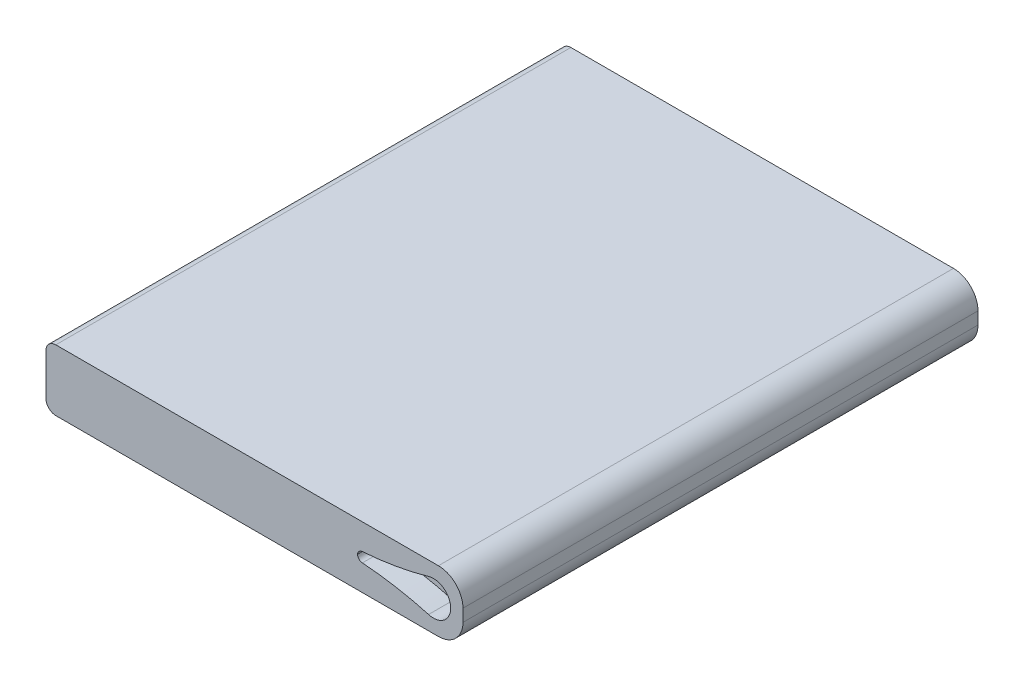
ISO-10303-21;
HEADER;
FILE_DESCRIPTION(('STEP AP214'),'2;1');
FILE_NAME('part.step','',(''),(''),'','','');
FILE_SCHEMA(('AUTOMOTIVE_DESIGN { 1 0 10303 214 1 1 1 1 }'));
ENDSEC;
DATA;
#1=APPLICATION_CONTEXT('core data for automotive mechanical design processes');
#2=APPLICATION_PROTOCOL_DEFINITION('international standard','automotive_design',2000,#1);
#3=PRODUCT_CONTEXT('',#1,'mechanical');
#4=PRODUCT('Part','Part','',(#3));
#5=PRODUCT_RELATED_PRODUCT_CATEGORY('part','',(#4));
#6=PRODUCT_DEFINITION_FORMATION('','',#4);
#7=PRODUCT_DEFINITION_CONTEXT('part definition',#1,'design');
#8=PRODUCT_DEFINITION('design','',#6,#7);
#9=PRODUCT_DEFINITION_SHAPE('','',#8);
#10=(LENGTH_UNIT() NAMED_UNIT(*) SI_UNIT(.MILLI.,.METRE.));
#11=(NAMED_UNIT(*) PLANE_ANGLE_UNIT() SI_UNIT($,.RADIAN.));
#12=(NAMED_UNIT(*) SI_UNIT($,.STERADIAN.) SOLID_ANGLE_UNIT());
#13=UNCERTAINTY_MEASURE_WITH_UNIT(LENGTH_MEASURE(1.E-05),#10,'distance_accuracy_value','');
#14=(GEOMETRIC_REPRESENTATION_CONTEXT(3) GLOBAL_UNCERTAINTY_ASSIGNED_CONTEXT((#13)) GLOBAL_UNIT_ASSIGNED_CONTEXT((#10,
#11,#12)) REPRESENTATION_CONTEXT('',''));
#15=CARTESIAN_POINT('',(0.,0.,0.));
#16=DIRECTION('',(0.,0.,1.));
#17=DIRECTION('',(1.,0.,0.));
#18=AXIS2_PLACEMENT_3D('',#15,#16,#17);
#19=CARTESIAN_POINT('',(0.,12.5,0.));
#20=DIRECTION('',(0.,0.,-1.));
#21=DIRECTION('',(-1.,0.,0.));
#22=AXIS2_PLACEMENT_3D('',#19,#20,#21);
#23=PLANE('',#22);
#24=DIRECTION('',(0.,-1.,0.));
#25=VECTOR('',#24,1.);
#26=CARTESIAN_POINT('',(-4.99999999999999,12.5,0.));
#27=LINE('',#26,#25);
#28=CARTESIAN_POINT('',(-4.99999999999999,10.5,0.));
#29=VERTEX_POINT('',#28);
#30=CARTESIAN_POINT('',(-4.99999999999999,2.,0.));
#31=VERTEX_POINT('',#30);
#32=EDGE_CURVE('E224',#29,#31,#27,.T.);
#33=ORIENTED_EDGE('',*,*,#32,.T.);
#34=CARTESIAN_POINT('',(-2.99999999999999,2.,0.));
#35=DIRECTION('',(0.,0.,-1.));
#36=DIRECTION('',(-1.,0.,0.));
#37=AXIS2_PLACEMENT_3D('',#34,#35,#36);
#38=CIRCLE('',#37,2.);
#39=CARTESIAN_POINT('',(-2.99999999999999,0.,0.));
#40=VERTEX_POINT('',#39);
#41=EDGE_CURVE('E298',#31,#40,#38,.F.);
#42=ORIENTED_EDGE('',*,*,#41,.T.);
#43=DIRECTION('',(1.,0.,0.));
#44=VECTOR('',#43,1.);
#45=CARTESIAN_POINT('',(0.,0.,0.));
#46=LINE('',#45,#44);
#47=CARTESIAN_POINT('',(75.,0.,0.));
#48=VERTEX_POINT('',#47);
#49=EDGE_CURVE('E237',#40,#48,#46,.T.);
#50=ORIENTED_EDGE('',*,*,#49,.T.);
#51=CARTESIAN_POINT('',(75.,5.,0.));
#52=DIRECTION('',(0.,0.,-1.));
#53=DIRECTION('',(-1.,0.,0.));
#54=AXIS2_PLACEMENT_3D('',#51,#52,#53);
#55=CIRCLE('',#54,5.);
#56=CARTESIAN_POINT('',(80.,5.,0.));
#57=VERTEX_POINT('',#56);
#58=EDGE_CURVE('E270',#48,#57,#55,.F.);
#59=ORIENTED_EDGE('',*,*,#58,.T.);
#60=DIRECTION('',(0.,-1.,0.));
#61=VECTOR('',#60,1.);
#62=CARTESIAN_POINT('',(80.,12.5,0.));
#63=LINE('',#62,#61);
#64=CARTESIAN_POINT('',(80.,7.5,0.));
#65=VERTEX_POINT('',#64);
#66=EDGE_CURVE('E247',#65,#57,#63,.T.);
#67=ORIENTED_EDGE('',*,*,#66,.F.);
#68=CARTESIAN_POINT('',(75.,7.5,0.));
#69=DIRECTION('',(0.,0.,-1.));
#70=DIRECTION('',(-1.,0.,0.));
#71=AXIS2_PLACEMENT_3D('',#68,#69,#70);
#72=CIRCLE('',#71,5.);
#73=CARTESIAN_POINT('',(75.,12.5,0.));
#74=VERTEX_POINT('',#73);
#75=EDGE_CURVE('E284',#65,#74,#72,.F.);
#76=ORIENTED_EDGE('',*,*,#75,.T.);
#77=DIRECTION('',(1.,0.,0.));
#78=VECTOR('',#77,1.);
#79=CARTESIAN_POINT('',(0.,12.5,0.));
#80=LINE('',#79,#78);
#81=CARTESIAN_POINT('',(-2.99999999999999,12.5,0.));
#82=VERTEX_POINT('',#81);
#83=EDGE_CURVE('E236',#82,#74,#80,.T.);
#84=ORIENTED_EDGE('',*,*,#83,.F.);
#85=CARTESIAN_POINT('',(-2.99999999999999,10.5,0.));
#86=DIRECTION('',(0.,0.,-1.));
#87=DIRECTION('',(-1.,0.,0.));
#88=AXIS2_PLACEMENT_3D('',#85,#86,#87);
#89=CIRCLE('',#88,2.);
#90=EDGE_CURVE('E295',#82,#29,#89,.F.);
#91=ORIENTED_EDGE('',*,*,#90,.T.);
#92=EDGE_LOOP('',(#33,#42,#50,#59,#67,#76,#84,#91));
#93=FACE_BOUND('',#92,.T.);
#94=CARTESIAN_POINT('',(59.5740057832264,6.17599421677323,0.));
#95=DIRECTION('',(0.,0.,1.));
#96=DIRECTION('',(1.,0.,0.));
#97=AXIS2_PLACEMENT_3D('',#94,#95,#96);
#98=CIRCLE('',#97,1.0765524967946);
#99=CARTESIAN_POINT('',(58.5,6.25,0.));
#100=VERTEX_POINT('',#99);
#101=CARTESIAN_POINT('',(59.5000000000056,7.25,0.));
#102=VERTEX_POINT('',#101);
#103=EDGE_CURVE('E174',#100,#102,#98,.F.);
#104=ORIENTED_EDGE('',*,*,#103,.T.);
#105=CARTESIAN_POINT('',(54.9560208388996,73.1943044244566,0.));
#106=DIRECTION('',(0.,0.,1.));
#107=DIRECTION('',(1.,0.,0.));
#108=AXIS2_PLACEMENT_3D('',#105,#106,#107);
#109=CIRCLE('',#108,66.1006734658731);
#110=CARTESIAN_POINT('',(73.,9.60410196624968,0.));
#111=VERTEX_POINT('',#110);
#112=EDGE_CURVE('E190',#102,#111,#109,.T.);
#113=ORIENTED_EDGE('',*,*,#112,.T.);
#114=CARTESIAN_POINT('',(74.,6.25,0.));
#115=DIRECTION('',(0.,0.,1.));
#116=DIRECTION('',(1.,0.,0.));
#117=AXIS2_PLACEMENT_3D('',#114,#115,#116);
#118=CIRCLE('',#117,3.50000000000001);
#119=CARTESIAN_POINT('',(73.,2.89589803375032,0.));
#120=VERTEX_POINT('',#119);
#121=EDGE_CURVE('E214',#120,#111,#118,.T.);
#122=ORIENTED_EDGE('',*,*,#121,.F.);
#123=CARTESIAN_POINT('',(54.231345292948,-64.8500801770038,0.));
#124=DIRECTION('',(0.,0.,1.));
#125=DIRECTION('',(1.,0.,0.));
#126=AXIS2_PLACEMENT_3D('',#123,#124,#125);
#127=CIRCLE('',#126,70.2977948675812);
#128=CARTESIAN_POINT('',(59.5000000000014,5.25,0.));
#129=VERTEX_POINT('',#128);
#130=EDGE_CURVE('E210',#129,#120,#127,.F.);
#131=ORIENTED_EDGE('',*,*,#130,.F.);
#132=CARTESIAN_POINT('',(59.5812669884853,6.33126698848544,0.));
#133=DIRECTION('',(0.,0.,1.));
#134=DIRECTION('',(1.,0.,0.));
#135=AXIS2_PLACEMENT_3D('',#132,#133,#134);
#136=CIRCLE('',#135,1.08431666214516);
#137=EDGE_CURVE('E207',#100,#129,#136,.T.);
#138=ORIENTED_EDGE('',*,*,#137,.F.);
#139=EDGE_LOOP('',(#104,#113,#122,#131,#138));
#140=FACE_BOUND('',#139,.T.);
#141=ADVANCED_FACE('F69',(#93,#140),#23,.F.);
#142=CARTESIAN_POINT('',(0.,12.5,-105.));
#143=DIRECTION('',(0.,0.,-1.));
#144=DIRECTION('',(-1.,0.,0.));
#145=AXIS2_PLACEMENT_3D('',#142,#143,#144);
#146=PLANE('',#145);
#147=DIRECTION('',(1.,0.,0.));
#148=VECTOR('',#147,1.);
#149=CARTESIAN_POINT('',(0.,0.,-105.));
#150=LINE('',#149,#148);
#151=CARTESIAN_POINT('',(-3.,0.,-105.));
#152=VERTEX_POINT('',#151);
#153=CARTESIAN_POINT('',(75.,0.,-105.));
#154=VERTEX_POINT('',#153);
#155=EDGE_CURVE('E241',#152,#154,#150,.T.);
#156=ORIENTED_EDGE('',*,*,#155,.F.);
#157=CARTESIAN_POINT('',(-3.,2.,-105.));
#158=DIRECTION('',(0.,0.,-1.));
#159=DIRECTION('',(-1.,0.,0.));
#160=AXIS2_PLACEMENT_3D('',#157,#158,#159);
#161=CIRCLE('',#160,2.);
#162=CARTESIAN_POINT('',(-5.,2.,-105.));
#163=VERTEX_POINT('',#162);
#164=EDGE_CURVE('E78',#152,#163,#161,.T.);
#165=ORIENTED_EDGE('',*,*,#164,.T.);
#166=DIRECTION('',(0.,-1.,0.));
#167=VECTOR('',#166,1.);
#168=CARTESIAN_POINT('',(-5.,12.5,-105.));
#169=LINE('',#168,#167);
#170=CARTESIAN_POINT('',(-5.,10.5,-105.));
#171=VERTEX_POINT('',#170);
#172=EDGE_CURVE('E244',#171,#163,#169,.T.);
#173=ORIENTED_EDGE('',*,*,#172,.F.);
#174=CARTESIAN_POINT('',(-3.,10.5,-105.));
#175=DIRECTION('',(0.,0.,-1.));
#176=DIRECTION('',(-1.,0.,0.));
#177=AXIS2_PLACEMENT_3D('',#174,#175,#176);
#178=CIRCLE('',#177,2.);
#179=CARTESIAN_POINT('',(-3.,12.5,-105.));
#180=VERTEX_POINT('',#179);
#181=EDGE_CURVE('E85',#171,#180,#178,.T.);
#182=ORIENTED_EDGE('',*,*,#181,.T.);
#183=DIRECTION('',(1.,0.,0.));
#184=VECTOR('',#183,1.);
#185=CARTESIAN_POINT('',(0.,12.5,-105.));
#186=LINE('',#185,#184);
#187=CARTESIAN_POINT('',(75.,12.5,-105.));
#188=VERTEX_POINT('',#187);
#189=EDGE_CURVE('E233',#180,#188,#186,.T.);
#190=ORIENTED_EDGE('',*,*,#189,.T.);
#191=CARTESIAN_POINT('',(75.,7.5,-105.));
#192=DIRECTION('',(0.,0.,-1.));
#193=DIRECTION('',(-1.,0.,0.));
#194=AXIS2_PLACEMENT_3D('',#191,#192,#193);
#195=CIRCLE('',#194,5.);
#196=CARTESIAN_POINT('',(80.,7.5,-105.));
#197=VERTEX_POINT('',#196);
#198=EDGE_CURVE('E278',#188,#197,#195,.T.);
#199=ORIENTED_EDGE('',*,*,#198,.T.);
#200=DIRECTION('',(0.,-1.,0.));
#201=VECTOR('',#200,1.);
#202=CARTESIAN_POINT('',(80.,12.5,-105.));
#203=LINE('',#202,#201);
#204=CARTESIAN_POINT('',(80.,5.,-105.));
#205=VERTEX_POINT('',#204);
#206=EDGE_CURVE('E240',#197,#205,#203,.T.);
#207=ORIENTED_EDGE('',*,*,#206,.T.);
#208=CARTESIAN_POINT('',(75.,5.,-105.));
#209=DIRECTION('',(0.,0.,-1.));
#210=DIRECTION('',(-1.,0.,0.));
#211=AXIS2_PLACEMENT_3D('',#208,#209,#210);
#212=CIRCLE('',#211,5.);
#213=EDGE_CURVE('E262',#205,#154,#212,.T.);
#214=ORIENTED_EDGE('',*,*,#213,.T.);
#215=EDGE_LOOP('',(#156,#165,#173,#182,#190,#199,#207,#214));
#216=FACE_BOUND('',#215,.T.);
#217=ADVANCED_FACE('F306',(#216),#146,.T.);
#218=CARTESIAN_POINT('',(0.,0.,0.));
#219=DIRECTION('',(0.,1.,0.));
#220=DIRECTION('',(0.,0.,1.));
#221=AXIS2_PLACEMENT_3D('',#218,#219,#220);
#222=PLANE('',#221);
#223=ORIENTED_EDGE('',*,*,#49,.F.);
#224=DIRECTION('',(0.,0.,1.));
#225=VECTOR('',#224,1.);
#226=CARTESIAN_POINT('',(-2.99999999999999,0.,0.));
#227=LINE('',#226,#225);
#228=EDGE_CURVE('E93',#40,#152,#227,.F.);
#229=ORIENTED_EDGE('',*,*,#228,.T.);
#230=ORIENTED_EDGE('',*,*,#155,.T.);
#231=DIRECTION('',(0.,0.,-1.));
#232=VECTOR('',#231,1.);
#233=CARTESIAN_POINT('',(75.,0.,0.));
#234=LINE('',#233,#232);
#235=EDGE_CURVE('E266',#154,#48,#234,.F.);
#236=ORIENTED_EDGE('',*,*,#235,.T.);
#237=EDGE_LOOP('',(#223,#229,#230,#236));
#238=FACE_BOUND('',#237,.T.);
#239=ADVANCED_FACE('F316',(#238),#222,.F.);
#240=CARTESIAN_POINT('',(80.,12.5,0.));
#241=DIRECTION('',(-1.,0.,0.));
#242=DIRECTION('',(0.,0.,1.));
#243=AXIS2_PLACEMENT_3D('',#240,#241,#242);
#244=PLANE('',#243);
#245=ORIENTED_EDGE('',*,*,#206,.F.);
#246=DIRECTION('',(0.,0.,-1.));
#247=VECTOR('',#246,1.);
#248=CARTESIAN_POINT('',(80.,7.5,0.));
#249=LINE('',#248,#247);
#250=EDGE_CURVE('E281',#197,#65,#249,.F.);
#251=ORIENTED_EDGE('',*,*,#250,.T.);
#252=ORIENTED_EDGE('',*,*,#66,.T.);
#253=DIRECTION('',(0.,0.,-1.));
#254=VECTOR('',#253,1.);
#255=CARTESIAN_POINT('',(80.,5.,0.));
#256=LINE('',#255,#254);
#257=EDGE_CURVE('E250',#57,#205,#256,.T.);
#258=ORIENTED_EDGE('',*,*,#257,.T.);
#259=EDGE_LOOP('',(#245,#251,#252,#258));
#260=FACE_BOUND('',#259,.T.);
#261=ADVANCED_FACE('F347',(#260),#244,.F.);
#262=CARTESIAN_POINT('',(0.,12.5,0.));
#263=DIRECTION('',(0.,1.,0.));
#264=DIRECTION('',(0.,0.,1.));
#265=AXIS2_PLACEMENT_3D('',#262,#263,#264);
#266=PLANE('',#265);
#267=ORIENTED_EDGE('',*,*,#189,.F.);
#268=DIRECTION('',(0.,0.,1.));
#269=VECTOR('',#268,1.);
#270=CARTESIAN_POINT('',(-2.99999999999999,12.5,0.));
#271=LINE('',#270,#269);
#272=EDGE_CURVE('E12',#180,#82,#271,.T.);
#273=ORIENTED_EDGE('',*,*,#272,.T.);
#274=ORIENTED_EDGE('',*,*,#83,.T.);
#275=DIRECTION('',(0.,0.,-1.));
#276=VECTOR('',#275,1.);
#277=CARTESIAN_POINT('',(75.,12.5,-105.));
#278=LINE('',#277,#276);
#279=EDGE_CURVE('E274',#74,#188,#278,.T.);
#280=ORIENTED_EDGE('',*,*,#279,.T.);
#281=EDGE_LOOP('',(#267,#273,#274,#280));
#282=FACE_BOUND('',#281,.T.);
#283=ADVANCED_FACE('F333',(#282),#266,.T.);
#284=CARTESIAN_POINT('',(-5.,12.5,-105.));
#285=DIRECTION('',(1.,0.,0.));
#286=DIRECTION('',(0.,0.,-1.));
#287=AXIS2_PLACEMENT_3D('',#284,#285,#286);
#288=PLANE('',#287);
#289=ORIENTED_EDGE('',*,*,#172,.T.);
#290=DIRECTION('',(0.,0.,1.));
#291=VECTOR('',#290,1.);
#292=CARTESIAN_POINT('',(-5.,2.,-105.));
#293=LINE('',#292,#291);
#294=EDGE_CURVE('E291',#163,#31,#293,.T.);
#295=ORIENTED_EDGE('',*,*,#294,.T.);
#296=ORIENTED_EDGE('',*,*,#32,.F.);
#297=DIRECTION('',(0.,0.,1.));
#298=VECTOR('',#297,1.);
#299=CARTESIAN_POINT('',(-5.,10.5,-105.));
#300=LINE('',#299,#298);
#301=EDGE_CURVE('E288',#29,#171,#300,.F.);
#302=ORIENTED_EDGE('',*,*,#301,.T.);
#303=EDGE_LOOP('',(#289,#295,#296,#302));
#304=FACE_BOUND('',#303,.T.);
#305=ADVANCED_FACE('F310',(#304),#288,.F.);
#306=CARTESIAN_POINT('',(59.5740057832264,6.17599421677323,-5.));
#307=DIRECTION('',(0.,0.,1.));
#308=DIRECTION('',(1.,0.,0.));
#309=AXIS2_PLACEMENT_3D('',#306,#307,#308);
#310=CYLINDRICAL_SURFACE('',#309,1.0765524967946);
#311=ORIENTED_EDGE('',*,*,#103,.F.);
#312=DIRECTION('',(0.,0.,1.));
#313=VECTOR('',#312,1.);
#314=CARTESIAN_POINT('',(58.5,6.25,-5.));
#315=LINE('',#314,#313);
#316=CARTESIAN_POINT('',(58.5,6.25,-5.));
#317=VERTEX_POINT('',#316);
#318=EDGE_CURVE('E167',#317,#100,#315,.T.);
#319=ORIENTED_EDGE('',*,*,#318,.F.);
#320=CARTESIAN_POINT('',(59.5740057832264,6.17599421677323,-5.));
#321=DIRECTION('',(0.,0.,1.));
#322=DIRECTION('',(1.,0.,0.));
#323=AXIS2_PLACEMENT_3D('',#320,#321,#322);
#324=CIRCLE('',#323,1.0765524967946);
#325=CARTESIAN_POINT('',(59.5000000000056,7.25,-5.));
#326=VERTEX_POINT('',#325);
#327=EDGE_CURVE('E171',#317,#326,#324,.F.);
#328=ORIENTED_EDGE('',*,*,#327,.T.);
#329=DIRECTION('',(0.,0.,1.));
#330=VECTOR('',#329,1.);
#331=CARTESIAN_POINT('',(59.5000000000056,7.25,-5.));
#332=LINE('',#331,#330);
#333=EDGE_CURVE('E221',#326,#102,#332,.T.);
#334=ORIENTED_EDGE('',*,*,#333,.T.);
#335=EDGE_LOOP('',(#311,#319,#328,#334));
#336=FACE_BOUND('',#335,.T.);
#337=ADVANCED_FACE('F169',(#336),#310,.F.);
#338=CARTESIAN_POINT('',(54.9560208388996,73.1943044244566,-5.));
#339=DIRECTION('',(0.,0.,1.));
#340=DIRECTION('',(1.,0.,0.));
#341=AXIS2_PLACEMENT_3D('',#338,#339,#340);
#342=CYLINDRICAL_SURFACE('',#341,66.1006734658731);
#343=ORIENTED_EDGE('',*,*,#112,.F.);
#344=ORIENTED_EDGE('',*,*,#333,.F.);
#345=CARTESIAN_POINT('',(54.9560208388996,73.1943044244566,-5.));
#346=DIRECTION('',(0.,0.,1.));
#347=DIRECTION('',(1.,0.,0.));
#348=AXIS2_PLACEMENT_3D('',#345,#346,#347);
#349=CIRCLE('',#348,66.1006734658731);
#350=CARTESIAN_POINT('',(73.,9.60410196624968,-5.));
#351=VERTEX_POINT('',#350);
#352=EDGE_CURVE('E181',#326,#351,#349,.T.);
#353=ORIENTED_EDGE('',*,*,#352,.T.);
#354=DIRECTION('',(0.,0.,1.));
#355=VECTOR('',#354,1.);
#356=CARTESIAN_POINT('',(73.,9.60410196624968,-5.));
#357=LINE('',#356,#355);
#358=EDGE_CURVE('E225',#351,#111,#357,.T.);
#359=ORIENTED_EDGE('',*,*,#358,.T.);
#360=EDGE_LOOP('',(#343,#344,#353,#359));
#361=FACE_BOUND('',#360,.T.);
#362=ADVANCED_FACE('F359',(#361),#342,.T.);
#363=CARTESIAN_POINT('',(74.,6.25,-5.));
#364=DIRECTION('',(0.,0.,1.));
#365=DIRECTION('',(1.,0.,0.));
#366=AXIS2_PLACEMENT_3D('',#363,#364,#365);
#367=CYLINDRICAL_SURFACE('',#366,3.50000000000001);
#368=ORIENTED_EDGE('',*,*,#121,.T.);
#369=ORIENTED_EDGE('',*,*,#358,.F.);
#370=CARTESIAN_POINT('',(74.,6.25,-5.));
#371=DIRECTION('',(0.,0.,1.));
#372=DIRECTION('',(1.,0.,0.));
#373=AXIS2_PLACEMENT_3D('',#370,#371,#372);
#374=CIRCLE('',#373,3.50000000000001);
#375=CARTESIAN_POINT('',(73.,2.89589803375032,-5.));
#376=VERTEX_POINT('',#375);
#377=EDGE_CURVE('E198',#376,#351,#374,.T.);
#378=ORIENTED_EDGE('',*,*,#377,.F.);
#379=DIRECTION('',(0.,0.,1.));
#380=VECTOR('',#379,1.);
#381=CARTESIAN_POINT('',(73.,2.89589803375032,-5.));
#382=LINE('',#381,#380);
#383=EDGE_CURVE('E228',#376,#120,#382,.T.);
#384=ORIENTED_EDGE('',*,*,#383,.T.);
#385=EDGE_LOOP('',(#368,#369,#378,#384));
#386=FACE_BOUND('',#385,.T.);
#387=ADVANCED_FACE('F365',(#386),#367,.F.);
#388=CARTESIAN_POINT('',(54.231345292948,-64.8500801770038,-5.));
#389=DIRECTION('',(0.,0.,1.));
#390=DIRECTION('',(1.,0.,0.));
#391=AXIS2_PLACEMENT_3D('',#388,#389,#390);
#392=CYLINDRICAL_SURFACE('',#391,70.2977948675812);
#393=ORIENTED_EDGE('',*,*,#130,.T.);
#394=ORIENTED_EDGE('',*,*,#383,.F.);
#395=CARTESIAN_POINT('',(54.231345292948,-64.8500801770038,-5.));
#396=DIRECTION('',(0.,0.,1.));
#397=DIRECTION('',(1.,0.,0.));
#398=AXIS2_PLACEMENT_3D('',#395,#396,#397);
#399=CIRCLE('',#398,70.2977948675812);
#400=CARTESIAN_POINT('',(59.5000000000014,5.25,-5.));
#401=VERTEX_POINT('',#400);
#402=EDGE_CURVE('E195',#401,#376,#399,.F.);
#403=ORIENTED_EDGE('',*,*,#402,.F.);
#404=DIRECTION('',(0.,0.,1.));
#405=VECTOR('',#404,1.);
#406=CARTESIAN_POINT('',(59.5000000000014,5.25,-5.));
#407=LINE('',#406,#405);
#408=EDGE_CURVE('E180',#401,#129,#407,.T.);
#409=ORIENTED_EDGE('',*,*,#408,.T.);
#410=EDGE_LOOP('',(#393,#394,#403,#409));
#411=FACE_BOUND('',#410,.T.);
#412=ADVANCED_FACE('F362',(#411),#392,.T.);
#413=CARTESIAN_POINT('',(59.5812669884853,6.33126698848544,-5.));
#414=DIRECTION('',(0.,0.,1.));
#415=DIRECTION('',(1.,0.,0.));
#416=AXIS2_PLACEMENT_3D('',#413,#414,#415);
#417=CYLINDRICAL_SURFACE('',#416,1.08431666214516);
#418=ORIENTED_EDGE('',*,*,#137,.T.);
#419=ORIENTED_EDGE('',*,*,#408,.F.);
#420=CARTESIAN_POINT('',(59.5812669884853,6.33126698848544,-5.));
#421=DIRECTION('',(0.,0.,1.));
#422=DIRECTION('',(1.,0.,0.));
#423=AXIS2_PLACEMENT_3D('',#420,#421,#422);
#424=CIRCLE('',#423,1.08431666214516);
#425=EDGE_CURVE('E187',#317,#401,#424,.T.);
#426=ORIENTED_EDGE('',*,*,#425,.F.);
#427=ORIENTED_EDGE('',*,*,#318,.T.);
#428=EDGE_LOOP('',(#418,#419,#426,#427));
#429=FACE_BOUND('',#428,.T.);
#430=ADVANCED_FACE('F192',(#429),#417,.F.);
#431=CARTESIAN_POINT('',(0.,0.,-5.));
#432=DIRECTION('',(0.,0.,1.));
#433=DIRECTION('',(1.,0.,0.));
#434=AXIS2_PLACEMENT_3D('',#431,#432,#433);
#435=PLANE('',#434);
#436=ORIENTED_EDGE('',*,*,#327,.F.);
#437=ORIENTED_EDGE('',*,*,#425,.T.);
#438=ORIENTED_EDGE('',*,*,#402,.T.);
#439=ORIENTED_EDGE('',*,*,#377,.T.);
#440=ORIENTED_EDGE('',*,*,#352,.F.);
#441=EDGE_LOOP('',(#436,#437,#438,#439,#440));
#442=FACE_BOUND('',#441,.T.);
#443=ADVANCED_FACE('F185',(#442),#435,.T.);
#444=CARTESIAN_POINT('',(75.,5.,0.));
#445=DIRECTION('',(0.,0.,-1.));
#446=DIRECTION('',(-1.,0.,0.));
#447=AXIS2_PLACEMENT_3D('',#444,#445,#446);
#448=CYLINDRICAL_SURFACE('',#447,5.);
#449=ORIENTED_EDGE('',*,*,#58,.F.);
#450=ORIENTED_EDGE('',*,*,#235,.F.);
#451=ORIENTED_EDGE('',*,*,#213,.F.);
#452=ORIENTED_EDGE('',*,*,#257,.F.);
#453=EDGE_LOOP('',(#449,#450,#451,#452));
#454=FACE_BOUND('',#453,.T.);
#455=ADVANCED_FACE('F322',(#454),#448,.T.);
#456=CARTESIAN_POINT('',(75.,7.5,0.));
#457=DIRECTION('',(0.,0.,1.));
#458=DIRECTION('',(1.,0.,0.));
#459=AXIS2_PLACEMENT_3D('',#456,#457,#458);
#460=CYLINDRICAL_SURFACE('',#459,5.);
#461=ORIENTED_EDGE('',*,*,#75,.F.);
#462=ORIENTED_EDGE('',*,*,#250,.F.);
#463=ORIENTED_EDGE('',*,*,#198,.F.);
#464=ORIENTED_EDGE('',*,*,#279,.F.);
#465=EDGE_LOOP('',(#461,#462,#463,#464));
#466=FACE_BOUND('',#465,.T.);
#467=ADVANCED_FACE('F330',(#466),#460,.T.);
#468=CARTESIAN_POINT('',(-3.,2.,-105.));
#469=DIRECTION('',(0.,0.,1.));
#470=DIRECTION('',(1.,0.,0.));
#471=AXIS2_PLACEMENT_3D('',#468,#469,#470);
#472=CYLINDRICAL_SURFACE('',#471,2.);
#473=ORIENTED_EDGE('',*,*,#164,.F.);
#474=ORIENTED_EDGE('',*,*,#228,.F.);
#475=ORIENTED_EDGE('',*,*,#41,.F.);
#476=ORIENTED_EDGE('',*,*,#294,.F.);
#477=EDGE_LOOP('',(#473,#474,#475,#476));
#478=FACE_BOUND('',#477,.T.);
#479=ADVANCED_FACE('F313',(#478),#472,.T.);
#480=CARTESIAN_POINT('',(-2.99999999999999,10.5,0.));
#481=DIRECTION('',(0.,0.,-1.));
#482=DIRECTION('',(-1.,0.,0.));
#483=AXIS2_PLACEMENT_3D('',#480,#481,#482);
#484=CYLINDRICAL_SURFACE('',#483,2.);
#485=ORIENTED_EDGE('',*,*,#181,.F.);
#486=ORIENTED_EDGE('',*,*,#301,.F.);
#487=ORIENTED_EDGE('',*,*,#90,.F.);
#488=ORIENTED_EDGE('',*,*,#272,.F.);
#489=EDGE_LOOP('',(#485,#486,#487,#488));
#490=FACE_BOUND('',#489,.T.);
#491=ADVANCED_FACE('F71',(#490),#484,.T.);
#492=CLOSED_SHELL('',(#141,#217,#239,#261,#283,#305,#337,#362,#387,#412,#430,#443,#455,#467,
#479,#491));
#493=MANIFOLD_SOLID_BREP('B2',#492);
#494=ADVANCED_BREP_SHAPE_REPRESENTATION('',(#18,#493),#14);
#495=SHAPE_DEFINITION_REPRESENTATION(#9,#494);
ENDSEC;
END-ISO-10303-21;
